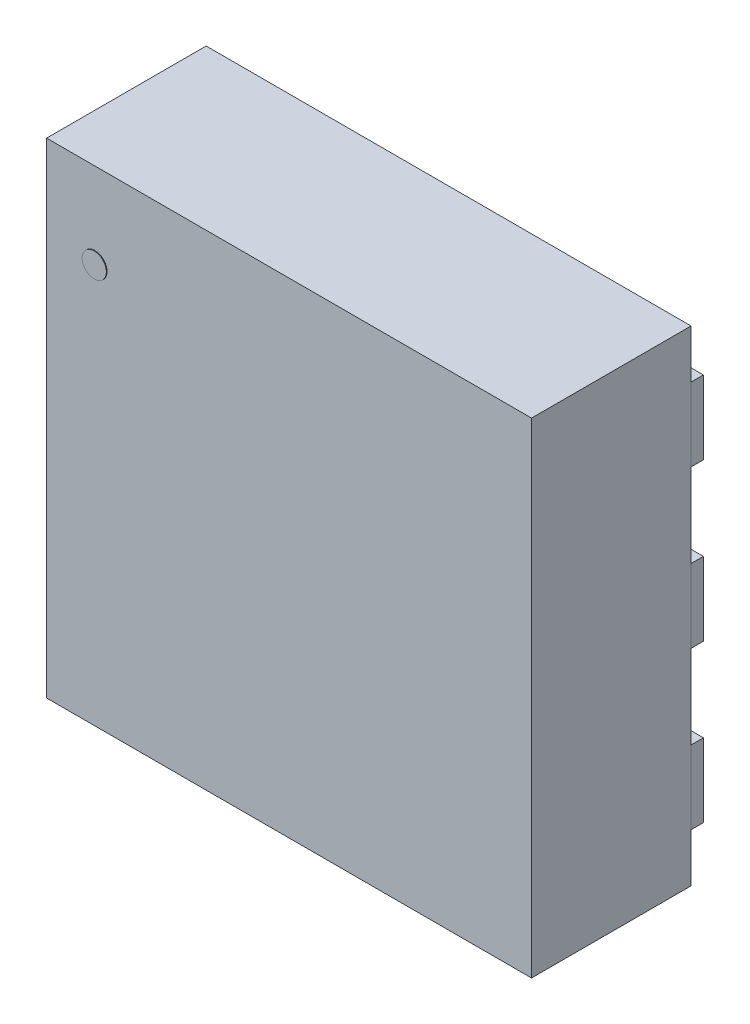
ISO-10303-21;
HEADER;
FILE_DESCRIPTION(('STEP AP214'),'2;1');
FILE_NAME('part.step','',(''),(''),'','','');
FILE_SCHEMA(('AUTOMOTIVE_DESIGN { 1 0 10303 214 1 1 1 1 }'));
ENDSEC;
DATA;
#1=APPLICATION_CONTEXT('core data for automotive mechanical design processes');
#2=APPLICATION_PROTOCOL_DEFINITION('international standard','automotive_design',2000,#1);
#3=PRODUCT_CONTEXT('',#1,'mechanical');
#4=PRODUCT('Part','Part','',(#3));
#5=PRODUCT_RELATED_PRODUCT_CATEGORY('part','',(#4));
#6=PRODUCT_DEFINITION_FORMATION('','',#4);
#7=PRODUCT_DEFINITION_CONTEXT('part definition',#1,'design');
#8=PRODUCT_DEFINITION('design','',#6,#7);
#9=PRODUCT_DEFINITION_SHAPE('','',#8);
#10=(LENGTH_UNIT() NAMED_UNIT(*) SI_UNIT(.MILLI.,.METRE.));
#11=(NAMED_UNIT(*) PLANE_ANGLE_UNIT() SI_UNIT($,.RADIAN.));
#12=(NAMED_UNIT(*) SI_UNIT($,.STERADIAN.) SOLID_ANGLE_UNIT());
#13=UNCERTAINTY_MEASURE_WITH_UNIT(LENGTH_MEASURE(1.E-05),#10,'distance_accuracy_value','');
#14=(GEOMETRIC_REPRESENTATION_CONTEXT(3) GLOBAL_UNCERTAINTY_ASSIGNED_CONTEXT((#13)) GLOBAL_UNIT_ASSIGNED_CONTEXT((#10,
#11,#12)) REPRESENTATION_CONTEXT('',''));
#15=CARTESIAN_POINT('',(0.,0.,0.));
#16=DIRECTION('',(0.,0.,1.));
#17=DIRECTION('',(1.,0.,0.));
#18=AXIS2_PLACEMENT_3D('',#15,#16,#17);
#19=CARTESIAN_POINT('',(-0.803,0.65,0.714));
#20=DIRECTION('',(0.,0.,1.));
#21=DIRECTION('',(1.,0.,0.));
#22=AXIS2_PLACEMENT_3D('',#19,#20,#21);
#23=PLANE('',#22);
#24=CARTESIAN_POINT('',(-0.803,0.65,0.714));
#25=DIRECTION('',(0.,0.,1.));
#26=DIRECTION('',(1.,0.,0.));
#27=AXIS2_PLACEMENT_3D('',#24,#25,#26);
#28=CIRCLE('',#27,0.050165);
#29=CARTESIAN_POINT('',(-0.752835,0.65,0.714));
#30=VERTEX_POINT('',#29);
#31=EDGE_CURVE('P0_E18',#30,#30,#28,.T.);
#32=ORIENTED_EDGE('',*,*,#31,.T.);
#33=EDGE_LOOP('',(#32));
#34=FACE_BOUND('',#33,.T.);
#35=ADVANCED_FACE('P0_F15',(#34),#23,.T.);
#36=CARTESIAN_POINT('',(-0.803,0.65,0.711));
#37=DIRECTION('',(0.,0.,1.));
#38=DIRECTION('',(1.,0.,0.));
#39=AXIS2_PLACEMENT_3D('',#36,#37,#38);
#40=PLANE('',#39);
#41=CARTESIAN_POINT('',(-0.803,0.65,0.711));
#42=DIRECTION('',(0.,0.,-1.));
#43=DIRECTION('',(1.,0.,0.));
#44=AXIS2_PLACEMENT_3D('',#41,#42,#43);
#45=CIRCLE('',#44,0.050165);
#46=CARTESIAN_POINT('',(-0.752835,0.65,0.711));
#47=VERTEX_POINT('',#46);
#48=EDGE_CURVE('P0_E10',#47,#47,#45,.T.);
#49=ORIENTED_EDGE('',*,*,#48,.T.);
#50=EDGE_LOOP('',(#49));
#51=FACE_BOUND('',#50,.T.);
#52=ADVANCED_FACE('P0_F37',(#51),#40,.F.);
#53=CARTESIAN_POINT('',(-0.803,0.65,0.711));
#54=DIRECTION('',(0.,0.,1.));
#55=DIRECTION('',(1.,0.,0.));
#56=AXIS2_PLACEMENT_3D('',#53,#54,#55);
#57=CYLINDRICAL_SURFACE('',#56,0.050165);
#58=ORIENTED_EDGE('',*,*,#31,.F.);
#59=EDGE_LOOP('',(#58));
#60=FACE_BOUND('',#59,.T.);
#61=ORIENTED_EDGE('',*,*,#48,.F.);
#62=EDGE_LOOP('',(#61));
#63=FACE_BOUND('',#62,.T.);
#64=ADVANCED_FACE('P0_F34',(#60,#63),#57,.T.);
#65=CLOSED_SHELL('',(#35,#52,#64));
#66=MANIFOLD_SOLID_BREP('P0_B1',#65);
#67=CARTESIAN_POINT('',(-1.003,-1.003,0.711));
#68=DIRECTION('',(0.,0.,1.));
#69=DIRECTION('',(1.,0.,0.));
#70=AXIS2_PLACEMENT_3D('',#67,#68,#69);
#71=PLANE('',#70);
#72=DIRECTION('',(1.,0.,0.));
#73=VECTOR('',#72,1.);
#74=CARTESIAN_POINT('',(-1.003,-1.003,0.711));
#75=LINE('',#74,#73);
#76=CARTESIAN_POINT('',(-1.003,-1.003,0.711));
#77=VERTEX_POINT('',#76);
#78=CARTESIAN_POINT('',(1.003,-1.003,0.711));
#79=VERTEX_POINT('',#78);
#80=EDGE_CURVE('P1_E71',#77,#79,#75,.T.);
#81=ORIENTED_EDGE('',*,*,#80,.T.);
#82=DIRECTION('',(0.,1.,0.));
#83=VECTOR('',#82,1.);
#84=CARTESIAN_POINT('',(1.003,-1.003,0.711));
#85=LINE('',#84,#83);
#86=CARTESIAN_POINT('',(1.003,1.003,0.711));
#87=VERTEX_POINT('',#86);
#88=EDGE_CURVE('P1_E104',#79,#87,#85,.T.);
#89=ORIENTED_EDGE('',*,*,#88,.T.);
#90=DIRECTION('',(-1.,0.,0.));
#91=VECTOR('',#90,1.);
#92=CARTESIAN_POINT('',(1.003,1.003,0.711));
#93=LINE('',#92,#91);
#94=CARTESIAN_POINT('',(-1.003,1.003,0.711));
#95=VERTEX_POINT('',#94);
#96=EDGE_CURVE('P1_E73',#87,#95,#93,.T.);
#97=ORIENTED_EDGE('',*,*,#96,.T.);
#98=DIRECTION('',(0.,-1.,0.));
#99=VECTOR('',#98,1.);
#100=CARTESIAN_POINT('',(-1.003,1.003,0.711));
#101=LINE('',#100,#99);
#102=EDGE_CURVE('P1_E11',#95,#77,#101,.T.);
#103=ORIENTED_EDGE('',*,*,#102,.T.);
#104=EDGE_LOOP('',(#81,#89,#97,#103));
#105=FACE_BOUND('',#104,.T.);
#106=ADVANCED_FACE('P1_F17',(#105),#71,.T.);
#107=CARTESIAN_POINT('',(-1.003,1.003,0.051));
#108=DIRECTION('',(0.,0.,-1.));
#109=DIRECTION('',(0.,-1.,0.));
#110=AXIS2_PLACEMENT_3D('',#107,#108,#109);
#111=PLANE('',#110);
#112=DIRECTION('',(1.,0.,0.));
#113=VECTOR('',#112,1.);
#114=CARTESIAN_POINT('',(-1.003,1.003,0.051));
#115=LINE('',#114,#113);
#116=CARTESIAN_POINT('',(-1.003,1.003,0.051));
#117=VERTEX_POINT('',#116);
#118=CARTESIAN_POINT('',(1.003,1.003,0.051));
#119=VERTEX_POINT('',#118);
#120=EDGE_CURVE('P1_E102',#117,#119,#115,.T.);
#121=ORIENTED_EDGE('',*,*,#120,.T.);
#122=DIRECTION('',(0.,-1.,0.));
#123=VECTOR('',#122,1.);
#124=CARTESIAN_POINT('',(1.003,1.003,0.051));
#125=LINE('',#124,#123);
#126=CARTESIAN_POINT('',(1.003,-1.003,0.051));
#127=VERTEX_POINT('',#126);
#128=EDGE_CURVE('P1_E81',#119,#127,#125,.T.);
#129=ORIENTED_EDGE('',*,*,#128,.T.);
#130=DIRECTION('',(-1.,0.,0.));
#131=VECTOR('',#130,1.);
#132=CARTESIAN_POINT('',(1.003,-1.003,0.051));
#133=LINE('',#132,#131);
#134=CARTESIAN_POINT('',(-1.003,-1.003,0.051));
#135=VERTEX_POINT('',#134);
#136=EDGE_CURVE('P1_E92',#127,#135,#133,.T.);
#137=ORIENTED_EDGE('',*,*,#136,.T.);
#138=DIRECTION('',(0.,1.,0.));
#139=VECTOR('',#138,1.);
#140=CARTESIAN_POINT('',(-1.003,-1.003,0.051));
#141=LINE('',#140,#139);
#142=EDGE_CURVE('P1_E20',#135,#117,#141,.T.);
#143=ORIENTED_EDGE('',*,*,#142,.T.);
#144=EDGE_LOOP('',(#121,#129,#137,#143));
#145=FACE_BOUND('',#144,.T.);
#146=ADVANCED_FACE('P1_F147',(#145),#111,.T.);
#147=CARTESIAN_POINT('',(-1.003,1.003,0.051));
#148=DIRECTION('',(-1.,0.,0.));
#149=DIRECTION('',(0.,0.,1.));
#150=AXIS2_PLACEMENT_3D('',#147,#148,#149);
#151=PLANE('',#150);
#152=ORIENTED_EDGE('',*,*,#142,.F.);
#153=DIRECTION('',(0.,0.,1.));
#154=VECTOR('',#153,1.);
#155=CARTESIAN_POINT('',(-1.003,-1.003,0.051));
#156=LINE('',#155,#154);
#157=EDGE_CURVE('P1_E76',#135,#77,#156,.T.);
#158=ORIENTED_EDGE('',*,*,#157,.T.);
#159=ORIENTED_EDGE('',*,*,#102,.F.);
#160=DIRECTION('',(0.,0.,-1.));
#161=VECTOR('',#160,1.);
#162=CARTESIAN_POINT('',(-1.003,1.003,0.711));
#163=LINE('',#162,#161);
#164=EDGE_CURVE('P1_E99',#95,#117,#163,.T.);
#165=ORIENTED_EDGE('',*,*,#164,.T.);
#166=EDGE_LOOP('',(#152,#158,#159,#165));
#167=FACE_BOUND('',#166,.T.);
#168=ADVANCED_FACE('P1_F77',(#167),#151,.T.);
#169=CARTESIAN_POINT('',(1.003,1.003,0.051));
#170=DIRECTION('',(0.,1.,0.));
#171=DIRECTION('',(1.,0.,0.));
#172=AXIS2_PLACEMENT_3D('',#169,#170,#171);
#173=PLANE('',#172);
#174=ORIENTED_EDGE('',*,*,#120,.F.);
#175=ORIENTED_EDGE('',*,*,#164,.F.);
#176=ORIENTED_EDGE('',*,*,#96,.F.);
#177=DIRECTION('',(0.,0.,-1.));
#178=VECTOR('',#177,1.);
#179=CARTESIAN_POINT('',(1.003,1.003,0.711));
#180=LINE('',#179,#178);
#181=EDGE_CURVE('P1_E96',#87,#119,#180,.T.);
#182=ORIENTED_EDGE('',*,*,#181,.T.);
#183=EDGE_LOOP('',(#174,#175,#176,#182));
#184=FACE_BOUND('',#183,.T.);
#185=ADVANCED_FACE('P1_F112',(#184),#173,.T.);
#186=CARTESIAN_POINT('',(1.003,-1.003,0.051));
#187=DIRECTION('',(1.,0.,0.));
#188=DIRECTION('',(0.,1.,0.));
#189=AXIS2_PLACEMENT_3D('',#186,#187,#188);
#190=PLANE('',#189);
#191=ORIENTED_EDGE('',*,*,#128,.F.);
#192=ORIENTED_EDGE('',*,*,#181,.F.);
#193=ORIENTED_EDGE('',*,*,#88,.F.);
#194=DIRECTION('',(0.,0.,-1.));
#195=VECTOR('',#194,1.);
#196=CARTESIAN_POINT('',(1.003,-1.003,0.711));
#197=LINE('',#196,#195);
#198=EDGE_CURVE('P1_E85',#79,#127,#197,.T.);
#199=ORIENTED_EDGE('',*,*,#198,.T.);
#200=EDGE_LOOP('',(#191,#192,#193,#199));
#201=FACE_BOUND('',#200,.T.);
#202=ADVANCED_FACE('P1_F118',(#201),#190,.T.);
#203=CARTESIAN_POINT('',(-1.003,-1.003,0.051));
#204=DIRECTION('',(0.,-1.,0.));
#205=DIRECTION('',(0.,0.,-1.));
#206=AXIS2_PLACEMENT_3D('',#203,#204,#205);
#207=PLANE('',#206);
#208=ORIENTED_EDGE('',*,*,#136,.F.);
#209=ORIENTED_EDGE('',*,*,#198,.F.);
#210=ORIENTED_EDGE('',*,*,#80,.F.);
#211=ORIENTED_EDGE('',*,*,#157,.F.);
#212=EDGE_LOOP('',(#208,#209,#210,#211));
#213=FACE_BOUND('',#212,.T.);
#214=ADVANCED_FACE('P1_F83',(#213),#207,.T.);
#215=CLOSED_SHELL('',(#106,#146,#168,#185,#202,#214));
#216=MANIFOLD_SOLID_BREP('P1_B1',#215);
#217=CARTESIAN_POINT('',(1.003,0.498,0.));
#218=DIRECTION('',(0.,0.,-1.));
#219=DIRECTION('',(0.,-1.,0.));
#220=AXIS2_PLACEMENT_3D('',#217,#218,#219);
#221=PLANE('',#220);
#222=DIRECTION('',(-1.,0.,0.));
#223=VECTOR('',#222,1.);
#224=CARTESIAN_POINT('',(1.003,0.498,0.));
#225=LINE('',#224,#223);
#226=CARTESIAN_POINT('',(1.003,0.498,0.));
#227=VERTEX_POINT('',#226);
#228=CARTESIAN_POINT('',(0.572,0.498,0.));
#229=VERTEX_POINT('',#228);
#230=EDGE_CURVE('P2_E73',#227,#229,#225,.T.);
#231=ORIENTED_EDGE('',*,*,#230,.T.);
#232=DIRECTION('',(0.,1.,0.));
#233=VECTOR('',#232,1.);
#234=CARTESIAN_POINT('',(0.572,0.498,0.));
#235=LINE('',#234,#233);
#236=CARTESIAN_POINT('',(0.572,0.802,0.));
#237=VERTEX_POINT('',#236);
#238=EDGE_CURVE('P2_E11',#229,#237,#235,.T.);
#239=ORIENTED_EDGE('',*,*,#238,.T.);
#240=DIRECTION('',(1.,0.,0.));
#241=VECTOR('',#240,1.);
#242=CARTESIAN_POINT('',(0.572,0.802,0.));
#243=LINE('',#242,#241);
#244=CARTESIAN_POINT('',(1.003,0.802,0.));
#245=VERTEX_POINT('',#244);
#246=EDGE_CURVE('P2_E75',#237,#245,#243,.T.);
#247=ORIENTED_EDGE('',*,*,#246,.T.);
#248=DIRECTION('',(0.,-1.,0.));
#249=VECTOR('',#248,1.);
#250=CARTESIAN_POINT('',(1.003,0.802,0.));
#251=LINE('',#250,#249);
#252=EDGE_CURVE('P2_E26',#245,#227,#251,.T.);
#253=ORIENTED_EDGE('',*,*,#252,.T.);
#254=EDGE_LOOP('',(#231,#239,#247,#253));
#255=FACE_BOUND('',#254,.T.);
#256=ADVANCED_FACE('P2_F17',(#255),#221,.T.);
#257=CARTESIAN_POINT('',(0.572,0.802,0.));
#258=DIRECTION('',(-1.,0.,0.));
#259=DIRECTION('',(0.,0.,1.));
#260=AXIS2_PLACEMENT_3D('',#257,#258,#259);
#261=PLANE('',#260);
#262=ORIENTED_EDGE('',*,*,#238,.F.);
#263=DIRECTION('',(0.,0.,1.));
#264=VECTOR('',#263,1.);
#265=CARTESIAN_POINT('',(0.572,0.498,0.));
#266=LINE('',#265,#264);
#267=CARTESIAN_POINT('',(0.572,0.498,0.051));
#268=VERTEX_POINT('',#267);
#269=EDGE_CURVE('P2_E88',#229,#268,#266,.T.);
#270=ORIENTED_EDGE('',*,*,#269,.T.);
#271=DIRECTION('',(0.,1.,0.));
#272=VECTOR('',#271,1.);
#273=CARTESIAN_POINT('',(0.572,0.498,0.051));
#274=LINE('',#273,#272);
#275=CARTESIAN_POINT('',(0.572,0.802,0.051));
#276=VERTEX_POINT('',#275);
#277=EDGE_CURVE('P2_E38',#268,#276,#274,.T.);
#278=ORIENTED_EDGE('',*,*,#277,.T.);
#279=DIRECTION('',(0.,0.,-1.));
#280=VECTOR('',#279,1.);
#281=CARTESIAN_POINT('',(0.572,0.802,0.051));
#282=LINE('',#281,#280);
#283=EDGE_CURVE('P2_E101',#276,#237,#282,.T.);
#284=ORIENTED_EDGE('',*,*,#283,.T.);
#285=EDGE_LOOP('',(#262,#270,#278,#284));
#286=FACE_BOUND('',#285,.T.);
#287=ADVANCED_FACE('P2_F19',(#286),#261,.T.);
#288=CARTESIAN_POINT('',(1.003,0.498,0.));
#289=DIRECTION('',(1.,0.,0.));
#290=DIRECTION('',(0.,1.,0.));
#291=AXIS2_PLACEMENT_3D('',#288,#289,#290);
#292=PLANE('',#291);
#293=DIRECTION('',(0.,-1.,0.));
#294=VECTOR('',#293,1.);
#295=CARTESIAN_POINT('',(1.003,0.802,0.051));
#296=LINE('',#295,#294);
#297=CARTESIAN_POINT('',(1.003,0.802,0.051));
#298=VERTEX_POINT('',#297);
#299=CARTESIAN_POINT('',(1.003,0.498,0.051));
#300=VERTEX_POINT('',#299);
#301=EDGE_CURVE('P2_E51',#298,#300,#296,.T.);
#302=ORIENTED_EDGE('',*,*,#301,.T.);
#303=DIRECTION('',(0.,0.,-1.));
#304=VECTOR('',#303,1.);
#305=CARTESIAN_POINT('',(1.003,0.498,0.356));
#306=LINE('',#305,#304);
#307=EDGE_CURVE('P2_E79',#300,#227,#306,.T.);
#308=ORIENTED_EDGE('',*,*,#307,.T.);
#309=ORIENTED_EDGE('',*,*,#252,.F.);
#310=DIRECTION('',(0.,0.,1.));
#311=VECTOR('',#310,1.);
#312=CARTESIAN_POINT('',(1.003,0.802,0.));
#313=LINE('',#312,#311);
#314=EDGE_CURVE('P2_E90',#245,#298,#313,.T.);
#315=ORIENTED_EDGE('',*,*,#314,.T.);
#316=EDGE_LOOP('',(#302,#308,#309,#315));
#317=FACE_BOUND('',#316,.T.);
#318=ADVANCED_FACE('P2_F80',(#317),#292,.T.);
#319=CARTESIAN_POINT('',(1.003,0.802,0.051));
#320=DIRECTION('',(0.,0.,1.));
#321=DIRECTION('',(1.,0.,0.));
#322=AXIS2_PLACEMENT_3D('',#319,#320,#321);
#323=PLANE('',#322);
#324=DIRECTION('',(-1.,0.,0.));
#325=VECTOR('',#324,1.);
#326=CARTESIAN_POINT('',(1.003,0.802,0.051));
#327=LINE('',#326,#325);
#328=EDGE_CURVE('P2_E96',#298,#276,#327,.T.);
#329=ORIENTED_EDGE('',*,*,#328,.T.);
#330=ORIENTED_EDGE('',*,*,#277,.F.);
#331=DIRECTION('',(1.,0.,0.));
#332=VECTOR('',#331,1.);
#333=CARTESIAN_POINT('',(0.572,0.498,0.051));
#334=LINE('',#333,#332);
#335=EDGE_CURVE('P2_E84',#268,#300,#334,.T.);
#336=ORIENTED_EDGE('',*,*,#335,.T.);
#337=ORIENTED_EDGE('',*,*,#301,.F.);
#338=EDGE_LOOP('',(#329,#330,#336,#337));
#339=FACE_BOUND('',#338,.T.);
#340=ADVANCED_FACE('P2_F137',(#339),#323,.T.);
#341=CARTESIAN_POINT('',(0.572,0.498,0.));
#342=DIRECTION('',(0.,-1.,0.));
#343=DIRECTION('',(0.,0.,-1.));
#344=AXIS2_PLACEMENT_3D('',#341,#342,#343);
#345=PLANE('',#344);
#346=ORIENTED_EDGE('',*,*,#230,.F.);
#347=ORIENTED_EDGE('',*,*,#307,.F.);
#348=ORIENTED_EDGE('',*,*,#335,.F.);
#349=ORIENTED_EDGE('',*,*,#269,.F.);
#350=EDGE_LOOP('',(#346,#347,#348,#349));
#351=FACE_BOUND('',#350,.T.);
#352=ADVANCED_FACE('P2_F87',(#351),#345,.T.);
#353=CARTESIAN_POINT('',(1.003,0.802,0.));
#354=DIRECTION('',(0.,1.,0.));
#355=DIRECTION('',(1.,0.,0.));
#356=AXIS2_PLACEMENT_3D('',#353,#354,#355);
#357=PLANE('',#356);
#358=ORIENTED_EDGE('',*,*,#246,.F.);
#359=ORIENTED_EDGE('',*,*,#283,.F.);
#360=ORIENTED_EDGE('',*,*,#328,.F.);
#361=ORIENTED_EDGE('',*,*,#314,.F.);
#362=EDGE_LOOP('',(#358,#359,#360,#361));
#363=FACE_BOUND('',#362,.T.);
#364=ADVANCED_FACE('P2_F119',(#363),#357,.T.);
#365=CLOSED_SHELL('',(#256,#287,#318,#340,#352,#364));
#366=MANIFOLD_SOLID_BREP('P2_B1',#365);
#367=CARTESIAN_POINT('',(1.003,-0.152,0.));
#368=DIRECTION('',(0.,0.,-1.));
#369=DIRECTION('',(0.,-1.,0.));
#370=AXIS2_PLACEMENT_3D('',#367,#368,#369);
#371=PLANE('',#370);
#372=DIRECTION('',(-1.,0.,0.));
#373=VECTOR('',#372,1.);
#374=CARTESIAN_POINT('',(1.003,-0.152,0.));
#375=LINE('',#374,#373);
#376=CARTESIAN_POINT('',(1.003,-0.152,0.));
#377=VERTEX_POINT('',#376);
#378=CARTESIAN_POINT('',(0.572,-0.152,0.));
#379=VERTEX_POINT('',#378);
#380=EDGE_CURVE('P3_E67',#377,#379,#375,.T.);
#381=ORIENTED_EDGE('',*,*,#380,.T.);
#382=DIRECTION('',(0.,1.,0.));
#383=VECTOR('',#382,1.);
#384=CARTESIAN_POINT('',(0.572,-0.152,0.));
#385=LINE('',#384,#383);
#386=CARTESIAN_POINT('',(0.572,0.152,0.));
#387=VERTEX_POINT('',#386);
#388=EDGE_CURVE('P3_E11',#379,#387,#385,.T.);
#389=ORIENTED_EDGE('',*,*,#388,.T.);
#390=DIRECTION('',(1.,0.,0.));
#391=VECTOR('',#390,1.);
#392=CARTESIAN_POINT('',(0.572,0.152,0.));
#393=LINE('',#392,#391);
#394=CARTESIAN_POINT('',(1.003,0.152,0.));
#395=VERTEX_POINT('',#394);
#396=EDGE_CURVE('P3_E69',#387,#395,#393,.T.);
#397=ORIENTED_EDGE('',*,*,#396,.T.);
#398=DIRECTION('',(0.,-1.,0.));
#399=VECTOR('',#398,1.);
#400=CARTESIAN_POINT('',(1.003,0.152,0.));
#401=LINE('',#400,#399);
#402=EDGE_CURVE('P3_E26',#395,#377,#401,.T.);
#403=ORIENTED_EDGE('',*,*,#402,.T.);
#404=EDGE_LOOP('',(#381,#389,#397,#403));
#405=FACE_BOUND('',#404,.T.);
#406=ADVANCED_FACE('P3_F17',(#405),#371,.T.);
#407=CARTESIAN_POINT('',(0.572,0.152,0.));
#408=DIRECTION('',(-1.,0.,0.));
#409=DIRECTION('',(0.,0.,1.));
#410=AXIS2_PLACEMENT_3D('',#407,#408,#409);
#411=PLANE('',#410);
#412=ORIENTED_EDGE('',*,*,#388,.F.);
#413=DIRECTION('',(0.,0.,1.));
#414=VECTOR('',#413,1.);
#415=CARTESIAN_POINT('',(0.572,-0.152,0.));
#416=LINE('',#415,#414);
#417=CARTESIAN_POINT('',(0.572,-0.152,0.051));
#418=VERTEX_POINT('',#417);
#419=EDGE_CURVE('P3_E86',#379,#418,#416,.T.);
#420=ORIENTED_EDGE('',*,*,#419,.T.);
#421=DIRECTION('',(0.,1.,0.));
#422=VECTOR('',#421,1.);
#423=CARTESIAN_POINT('',(0.572,-0.152,0.051));
#424=LINE('',#423,#422);
#425=CARTESIAN_POINT('',(0.572,0.152,0.051));
#426=VERTEX_POINT('',#425);
#427=EDGE_CURVE('P3_E38',#418,#426,#424,.T.);
#428=ORIENTED_EDGE('',*,*,#427,.T.);
#429=DIRECTION('',(0.,0.,-1.));
#430=VECTOR('',#429,1.);
#431=CARTESIAN_POINT('',(0.572,0.152,0.051));
#432=LINE('',#431,#430);
#433=EDGE_CURVE('P3_E164',#426,#387,#432,.T.);
#434=ORIENTED_EDGE('',*,*,#433,.T.);
#435=EDGE_LOOP('',(#412,#420,#428,#434));
#436=FACE_BOUND('',#435,.T.);
#437=ADVANCED_FACE('P3_F140',(#436),#411,.T.);
#438=CARTESIAN_POINT('',(1.003,-0.152,0.));
#439=DIRECTION('',(1.,0.,0.));
#440=DIRECTION('',(0.,1.,0.));
#441=AXIS2_PLACEMENT_3D('',#438,#439,#440);
#442=PLANE('',#441);
#443=DIRECTION('',(0.,-1.,0.));
#444=VECTOR('',#443,1.);
#445=CARTESIAN_POINT('',(1.003,0.152,0.051));
#446=LINE('',#445,#444);
#447=CARTESIAN_POINT('',(1.003,0.152,0.051));
#448=VERTEX_POINT('',#447);
#449=CARTESIAN_POINT('',(1.003,-0.152,0.051));
#450=VERTEX_POINT('',#449);
#451=EDGE_CURVE('P3_E74',#448,#450,#446,.T.);
#452=ORIENTED_EDGE('',*,*,#451,.T.);
#453=DIRECTION('',(0.,0.,-1.));
#454=VECTOR('',#453,1.);
#455=CARTESIAN_POINT('',(1.003,-0.152,0.356));
#456=LINE('',#455,#454);
#457=EDGE_CURVE('P3_E77',#450,#377,#456,.T.);
#458=ORIENTED_EDGE('',*,*,#457,.T.);
#459=ORIENTED_EDGE('',*,*,#402,.F.);
#460=DIRECTION('',(0.,0.,1.));
#461=VECTOR('',#460,1.);
#462=CARTESIAN_POINT('',(1.003,0.152,0.));
#463=LINE('',#462,#461);
#464=EDGE_CURVE('P3_E88',#395,#448,#463,.T.);
#465=ORIENTED_EDGE('',*,*,#464,.T.);
#466=EDGE_LOOP('',(#452,#458,#459,#465));
#467=FACE_BOUND('',#466,.T.);
#468=ADVANCED_FACE('P3_F78',(#467),#442,.T.);
#469=CARTESIAN_POINT('',(1.003,0.152,0.051));
#470=DIRECTION('',(0.,0.,1.));
#471=DIRECTION('',(1.,0.,0.));
#472=AXIS2_PLACEMENT_3D('',#469,#470,#471);
#473=PLANE('',#472);
#474=DIRECTION('',(-1.,0.,0.));
#475=VECTOR('',#474,1.);
#476=CARTESIAN_POINT('',(1.003,0.152,0.051));
#477=LINE('',#476,#475);
#478=EDGE_CURVE('P3_E93',#448,#426,#477,.T.);
#479=ORIENTED_EDGE('',*,*,#478,.T.);
#480=ORIENTED_EDGE('',*,*,#427,.F.);
#481=DIRECTION('',(1.,0.,0.));
#482=VECTOR('',#481,1.);
#483=CARTESIAN_POINT('',(0.572,-0.152,0.051));
#484=LINE('',#483,#482);
#485=EDGE_CURVE('P3_E82',#418,#450,#484,.T.);
#486=ORIENTED_EDGE('',*,*,#485,.T.);
#487=ORIENTED_EDGE('',*,*,#451,.F.);
#488=EDGE_LOOP('',(#479,#480,#486,#487));
#489=FACE_BOUND('',#488,.T.);
#490=ADVANCED_FACE('P3_F121',(#489),#473,.T.);
#491=CARTESIAN_POINT('',(0.572,-0.152,0.));
#492=DIRECTION('',(0.,-1.,0.));
#493=DIRECTION('',(0.,0.,-1.));
#494=AXIS2_PLACEMENT_3D('',#491,#492,#493);
#495=PLANE('',#494);
#496=ORIENTED_EDGE('',*,*,#380,.F.);
#497=ORIENTED_EDGE('',*,*,#457,.F.);
#498=ORIENTED_EDGE('',*,*,#485,.F.);
#499=ORIENTED_EDGE('',*,*,#419,.F.);
#500=EDGE_LOOP('',(#496,#497,#498,#499));
#501=FACE_BOUND('',#500,.T.);
#502=ADVANCED_FACE('P3_F85',(#501),#495,.T.);
#503=CARTESIAN_POINT('',(1.003,0.152,0.));
#504=DIRECTION('',(0.,1.,0.));
#505=DIRECTION('',(1.,0.,0.));
#506=AXIS2_PLACEMENT_3D('',#503,#504,#505);
#507=PLANE('',#506);
#508=ORIENTED_EDGE('',*,*,#396,.F.);
#509=ORIENTED_EDGE('',*,*,#433,.F.);
#510=ORIENTED_EDGE('',*,*,#478,.F.);
#511=ORIENTED_EDGE('',*,*,#464,.F.);
#512=EDGE_LOOP('',(#508,#509,#510,#511));
#513=FACE_BOUND('',#512,.T.);
#514=ADVANCED_FACE('P3_F103',(#513),#507,.T.);
#515=CLOSED_SHELL('',(#406,#437,#468,#490,#502,#514));
#516=MANIFOLD_SOLID_BREP('P3_B1',#515);
#517=CARTESIAN_POINT('',(1.003,-0.802,0.));
#518=DIRECTION('',(0.,0.,-1.));
#519=DIRECTION('',(0.,-1.,0.));
#520=AXIS2_PLACEMENT_3D('',#517,#518,#519);
#521=PLANE('',#520);
#522=DIRECTION('',(-1.,0.,0.));
#523=VECTOR('',#522,1.);
#524=CARTESIAN_POINT('',(1.003,-0.802,0.));
#525=LINE('',#524,#523);
#526=CARTESIAN_POINT('',(1.003,-0.802,0.));
#527=VERTEX_POINT('',#526);
#528=CARTESIAN_POINT('',(0.572,-0.802,0.));
#529=VERTEX_POINT('',#528);
#530=EDGE_CURVE('P4_E76',#527,#529,#525,.T.);
#531=ORIENTED_EDGE('',*,*,#530,.T.);
#532=DIRECTION('',(0.,1.,0.));
#533=VECTOR('',#532,1.);
#534=CARTESIAN_POINT('',(0.572,-0.802,0.));
#535=LINE('',#534,#533);
#536=CARTESIAN_POINT('',(0.572,-0.498,0.));
#537=VERTEX_POINT('',#536);
#538=EDGE_CURVE('P4_E11',#529,#537,#535,.T.);
#539=ORIENTED_EDGE('',*,*,#538,.T.);
#540=DIRECTION('',(1.,0.,0.));
#541=VECTOR('',#540,1.);
#542=CARTESIAN_POINT('',(0.572,-0.498,0.));
#543=LINE('',#542,#541);
#544=CARTESIAN_POINT('',(1.003,-0.498,0.));
#545=VERTEX_POINT('',#544);
#546=EDGE_CURVE('P4_E74',#537,#545,#543,.T.);
#547=ORIENTED_EDGE('',*,*,#546,.T.);
#548=DIRECTION('',(0.,-1.,0.));
#549=VECTOR('',#548,1.);
#550=CARTESIAN_POINT('',(1.003,-0.498,0.));
#551=LINE('',#550,#549);
#552=EDGE_CURVE('P4_E25',#545,#527,#551,.T.);
#553=ORIENTED_EDGE('',*,*,#552,.T.);
#554=EDGE_LOOP('',(#531,#539,#547,#553));
#555=FACE_BOUND('',#554,.T.);
#556=ADVANCED_FACE('P4_F17',(#555),#521,.T.);
#557=CARTESIAN_POINT('',(0.572,-0.498,0.));
#558=DIRECTION('',(-1.,0.,0.));
#559=DIRECTION('',(0.,0.,1.));
#560=AXIS2_PLACEMENT_3D('',#557,#558,#559);
#561=PLANE('',#560);
#562=ORIENTED_EDGE('',*,*,#538,.F.);
#563=DIRECTION('',(0.,0.,1.));
#564=VECTOR('',#563,1.);
#565=CARTESIAN_POINT('',(0.572,-0.802,0.));
#566=LINE('',#565,#564);
#567=CARTESIAN_POINT('',(0.572,-0.802,0.051));
#568=VERTEX_POINT('',#567);
#569=EDGE_CURVE('P4_E95',#529,#568,#566,.T.);
#570=ORIENTED_EDGE('',*,*,#569,.T.);
#571=DIRECTION('',(0.,1.,0.));
#572=VECTOR('',#571,1.);
#573=CARTESIAN_POINT('',(0.572,-0.802,0.051));
#574=LINE('',#573,#572);
#575=CARTESIAN_POINT('',(0.572,-0.498,0.051));
#576=VERTEX_POINT('',#575);
#577=EDGE_CURVE('P4_E37',#568,#576,#574,.T.);
#578=ORIENTED_EDGE('',*,*,#577,.T.);
#579=DIRECTION('',(0.,0.,-1.));
#580=VECTOR('',#579,1.);
#581=CARTESIAN_POINT('',(0.572,-0.498,0.051));
#582=LINE('',#581,#580);
#583=EDGE_CURVE('P4_E80',#576,#537,#582,.T.);
#584=ORIENTED_EDGE('',*,*,#583,.T.);
#585=EDGE_LOOP('',(#562,#570,#578,#584));
#586=FACE_BOUND('',#585,.T.);
#587=ADVANCED_FACE('P4_F81',(#586),#561,.T.);
#588=CARTESIAN_POINT('',(1.003,-0.802,0.));
#589=DIRECTION('',(1.,0.,0.));
#590=DIRECTION('',(0.,1.,0.));
#591=AXIS2_PLACEMENT_3D('',#588,#589,#590);
#592=PLANE('',#591);
#593=DIRECTION('',(0.,-1.,0.));
#594=VECTOR('',#593,1.);
#595=CARTESIAN_POINT('',(1.003,-0.498,0.051));
#596=LINE('',#595,#594);
#597=CARTESIAN_POINT('',(1.003,-0.498,0.051));
#598=VERTEX_POINT('',#597);
#599=CARTESIAN_POINT('',(1.003,-0.802,0.051));
#600=VERTEX_POINT('',#599);
#601=EDGE_CURVE('P4_E47',#598,#600,#596,.T.);
#602=ORIENTED_EDGE('',*,*,#601,.T.);
#603=DIRECTION('',(0.,0.,-1.));
#604=VECTOR('',#603,1.);
#605=CARTESIAN_POINT('',(1.003,-0.802,0.356));
#606=LINE('',#605,#604);
#607=EDGE_CURVE('P4_E103',#600,#527,#606,.T.);
#608=ORIENTED_EDGE('',*,*,#607,.T.);
#609=ORIENTED_EDGE('',*,*,#552,.F.);
#610=DIRECTION('',(0.,0.,1.));
#611=VECTOR('',#610,1.);
#612=CARTESIAN_POINT('',(1.003,-0.498,0.));
#613=LINE('',#612,#611);
#614=EDGE_CURVE('P4_E89',#545,#598,#613,.T.);
#615=ORIENTED_EDGE('',*,*,#614,.T.);
#616=EDGE_LOOP('',(#602,#608,#609,#615));
#617=FACE_BOUND('',#616,.T.);
#618=ADVANCED_FACE('P4_F115',(#617),#592,.T.);
#619=CARTESIAN_POINT('',(1.003,-0.498,0.051));
#620=DIRECTION('',(0.,0.,1.));
#621=DIRECTION('',(1.,0.,0.));
#622=AXIS2_PLACEMENT_3D('',#619,#620,#621);
#623=PLANE('',#622);
#624=DIRECTION('',(-1.,0.,0.));
#625=VECTOR('',#624,1.);
#626=CARTESIAN_POINT('',(1.003,-0.498,0.051));
#627=LINE('',#626,#625);
#628=EDGE_CURVE('P4_E85',#598,#576,#627,.T.);
#629=ORIENTED_EDGE('',*,*,#628,.T.);
#630=ORIENTED_EDGE('',*,*,#577,.F.);
#631=DIRECTION('',(1.,0.,0.));
#632=VECTOR('',#631,1.);
#633=CARTESIAN_POINT('',(0.572,-0.802,0.051));
#634=LINE('',#633,#632);
#635=EDGE_CURVE('P4_E104',#568,#600,#634,.T.);
#636=ORIENTED_EDGE('',*,*,#635,.T.);
#637=ORIENTED_EDGE('',*,*,#601,.F.);
#638=EDGE_LOOP('',(#629,#630,#636,#637));
#639=FACE_BOUND('',#638,.T.);
#640=ADVANCED_FACE('P4_F122',(#639),#623,.T.);
#641=CARTESIAN_POINT('',(0.572,-0.802,0.));
#642=DIRECTION('',(0.,-1.,0.));
#643=DIRECTION('',(0.,0.,-1.));
#644=AXIS2_PLACEMENT_3D('',#641,#642,#643);
#645=PLANE('',#644);
#646=ORIENTED_EDGE('',*,*,#530,.F.);
#647=ORIENTED_EDGE('',*,*,#607,.F.);
#648=ORIENTED_EDGE('',*,*,#635,.F.);
#649=ORIENTED_EDGE('',*,*,#569,.F.);
#650=EDGE_LOOP('',(#646,#647,#648,#649));
#651=FACE_BOUND('',#650,.T.);
#652=ADVANCED_FACE('P4_F118',(#651),#645,.T.);
#653=CARTESIAN_POINT('',(1.003,-0.498,0.));
#654=DIRECTION('',(0.,1.,0.));
#655=DIRECTION('',(1.,0.,0.));
#656=AXIS2_PLACEMENT_3D('',#653,#654,#655);
#657=PLANE('',#656);
#658=ORIENTED_EDGE('',*,*,#546,.F.);
#659=ORIENTED_EDGE('',*,*,#583,.F.);
#660=ORIENTED_EDGE('',*,*,#628,.F.);
#661=ORIENTED_EDGE('',*,*,#614,.F.);
#662=EDGE_LOOP('',(#658,#659,#660,#661));
#663=FACE_BOUND('',#662,.T.);
#664=ADVANCED_FACE('P4_F88',(#663),#657,.T.);
#665=CLOSED_SHELL('',(#556,#587,#618,#640,#652,#664));
#666=MANIFOLD_SOLID_BREP('P4_B1',#665);
#667=CARTESIAN_POINT('',(-1.003,-0.498,0.));
#668=DIRECTION('',(0.,0.,-1.));
#669=DIRECTION('',(0.,-1.,0.));
#670=AXIS2_PLACEMENT_3D('',#667,#668,#669);
#671=PLANE('',#670);
#672=DIRECTION('',(1.,0.,0.));
#673=VECTOR('',#672,1.);
#674=CARTESIAN_POINT('',(-1.003,-0.498,0.));
#675=LINE('',#674,#673);
#676=CARTESIAN_POINT('',(-1.003,-0.498,0.));
#677=VERTEX_POINT('',#676);
#678=CARTESIAN_POINT('',(-0.572,-0.498,0.));
#679=VERTEX_POINT('',#678);
#680=EDGE_CURVE('P5_E77',#677,#679,#675,.T.);
#681=ORIENTED_EDGE('',*,*,#680,.T.);
#682=DIRECTION('',(0.,-1.,0.));
#683=VECTOR('',#682,1.);
#684=CARTESIAN_POINT('',(-0.572,-0.498,0.));
#685=LINE('',#684,#683);
#686=CARTESIAN_POINT('',(-0.572,-0.802,0.));
#687=VERTEX_POINT('',#686);
#688=EDGE_CURVE('P5_E11',#679,#687,#685,.T.);
#689=ORIENTED_EDGE('',*,*,#688,.T.);
#690=DIRECTION('',(-1.,0.,0.));
#691=VECTOR('',#690,1.);
#692=CARTESIAN_POINT('',(-0.572,-0.802,0.));
#693=LINE('',#692,#691);
#694=CARTESIAN_POINT('',(-1.003,-0.802,0.));
#695=VERTEX_POINT('',#694);
#696=EDGE_CURVE('P5_E75',#687,#695,#693,.T.);
#697=ORIENTED_EDGE('',*,*,#696,.T.);
#698=DIRECTION('',(0.,1.,0.));
#699=VECTOR('',#698,1.);
#700=CARTESIAN_POINT('',(-1.003,-0.802,0.));
#701=LINE('',#700,#699);
#702=EDGE_CURVE('P5_E26',#695,#677,#701,.T.);
#703=ORIENTED_EDGE('',*,*,#702,.T.);
#704=EDGE_LOOP('',(#681,#689,#697,#703));
#705=FACE_BOUND('',#704,.T.);
#706=ADVANCED_FACE('P5_F17',(#705),#671,.T.);
#707=CARTESIAN_POINT('',(-0.572,-0.802,0.));
#708=DIRECTION('',(1.,0.,0.));
#709=DIRECTION('',(0.,1.,0.));
#710=AXIS2_PLACEMENT_3D('',#707,#708,#709);
#711=PLANE('',#710);
#712=ORIENTED_EDGE('',*,*,#688,.F.);
#713=DIRECTION('',(0.,0.,1.));
#714=VECTOR('',#713,1.);
#715=CARTESIAN_POINT('',(-0.572,-0.498,0.));
#716=LINE('',#715,#714);
#717=CARTESIAN_POINT('',(-0.572,-0.498,0.051));
#718=VERTEX_POINT('',#717);
#719=EDGE_CURVE('P5_E109',#679,#718,#716,.T.);
#720=ORIENTED_EDGE('',*,*,#719,.T.);
#721=DIRECTION('',(0.,-1.,0.));
#722=VECTOR('',#721,1.);
#723=CARTESIAN_POINT('',(-0.572,-0.498,0.051));
#724=LINE('',#723,#722);
#725=CARTESIAN_POINT('',(-0.572,-0.802,0.051));
#726=VERTEX_POINT('',#725);
#727=EDGE_CURVE('P5_E20',#718,#726,#724,.T.);
#728=ORIENTED_EDGE('',*,*,#727,.T.);
#729=DIRECTION('',(0.,0.,-1.));
#730=VECTOR('',#729,1.);
#731=CARTESIAN_POINT('',(-0.572,-0.802,0.051));
#732=LINE('',#731,#730);
#733=EDGE_CURVE('P5_E81',#726,#687,#732,.T.);
#734=ORIENTED_EDGE('',*,*,#733,.T.);
#735=EDGE_LOOP('',(#712,#720,#728,#734));
#736=FACE_BOUND('',#735,.T.);
#737=ADVANCED_FACE('P5_F82',(#736),#711,.T.);
#738=CARTESIAN_POINT('',(-1.003,-0.498,0.));
#739=DIRECTION('',(-1.,0.,0.));
#740=DIRECTION('',(0.,0.,1.));
#741=AXIS2_PLACEMENT_3D('',#738,#739,#740);
#742=PLANE('',#741);
#743=DIRECTION('',(0.,1.,0.));
#744=VECTOR('',#743,1.);
#745=CARTESIAN_POINT('',(-1.003,-0.802,0.051));
#746=LINE('',#745,#744);
#747=CARTESIAN_POINT('',(-1.003,-0.802,0.051));
#748=VERTEX_POINT('',#747);
#749=CARTESIAN_POINT('',(-1.003,-0.498,0.051));
#750=VERTEX_POINT('',#749);
#751=EDGE_CURVE('P5_E48',#748,#750,#746,.T.);
#752=ORIENTED_EDGE('',*,*,#751,.T.);
#753=DIRECTION('',(0.,0.,-1.));
#754=VECTOR('',#753,1.);
#755=CARTESIAN_POINT('',(-1.003,-0.498,0.356));
#756=LINE('',#755,#754);
#757=EDGE_CURVE('P5_E101',#750,#677,#756,.T.);
#758=ORIENTED_EDGE('',*,*,#757,.T.);
#759=ORIENTED_EDGE('',*,*,#702,.F.);
#760=DIRECTION('',(0.,0.,1.));
#761=VECTOR('',#760,1.);
#762=CARTESIAN_POINT('',(-1.003,-0.802,0.));
#763=LINE('',#762,#761);
#764=EDGE_CURVE('P5_E90',#695,#748,#763,.T.);
#765=ORIENTED_EDGE('',*,*,#764,.T.);
#766=EDGE_LOOP('',(#752,#758,#759,#765));
#767=FACE_BOUND('',#766,.T.);
#768=ADVANCED_FACE('P5_F115',(#767),#742,.T.);
#769=CARTESIAN_POINT('',(-1.003,-0.802,0.051));
#770=DIRECTION('',(0.,0.,1.));
#771=DIRECTION('',(1.,0.,0.));
#772=AXIS2_PLACEMENT_3D('',#769,#770,#771);
#773=PLANE('',#772);
#774=DIRECTION('',(1.,0.,0.));
#775=VECTOR('',#774,1.);
#776=CARTESIAN_POINT('',(-1.003,-0.802,0.051));
#777=LINE('',#776,#775);
#778=EDGE_CURVE('P5_E86',#748,#726,#777,.T.);
#779=ORIENTED_EDGE('',*,*,#778,.T.);
#780=ORIENTED_EDGE('',*,*,#727,.F.);
#781=DIRECTION('',(-1.,0.,0.));
#782=VECTOR('',#781,1.);
#783=CARTESIAN_POINT('',(-0.572,-0.498,0.051));
#784=LINE('',#783,#782);
#785=EDGE_CURVE('P5_E106',#718,#750,#784,.T.);
#786=ORIENTED_EDGE('',*,*,#785,.T.);
#787=ORIENTED_EDGE('',*,*,#751,.F.);
#788=EDGE_LOOP('',(#779,#780,#786,#787));
#789=FACE_BOUND('',#788,.T.);
#790=ADVANCED_FACE('P5_F119',(#789),#773,.T.);
#791=CARTESIAN_POINT('',(-0.572,-0.498,0.));
#792=DIRECTION('',(0.,1.,0.));
#793=DIRECTION('',(1.,0.,0.));
#794=AXIS2_PLACEMENT_3D('',#791,#792,#793);
#795=PLANE('',#794);
#796=ORIENTED_EDGE('',*,*,#680,.F.);
#797=ORIENTED_EDGE('',*,*,#757,.F.);
#798=ORIENTED_EDGE('',*,*,#785,.F.);
#799=ORIENTED_EDGE('',*,*,#719,.F.);
#800=EDGE_LOOP('',(#796,#797,#798,#799));
#801=FACE_BOUND('',#800,.T.);
#802=ADVANCED_FACE('P5_F118',(#801),#795,.T.);
#803=CARTESIAN_POINT('',(-1.003,-0.802,0.));
#804=DIRECTION('',(0.,-1.,0.));
#805=DIRECTION('',(0.,0.,-1.));
#806=AXIS2_PLACEMENT_3D('',#803,#804,#805);
#807=PLANE('',#806);
#808=ORIENTED_EDGE('',*,*,#696,.F.);
#809=ORIENTED_EDGE('',*,*,#733,.F.);
#810=ORIENTED_EDGE('',*,*,#778,.F.);
#811=ORIENTED_EDGE('',*,*,#764,.F.);
#812=EDGE_LOOP('',(#808,#809,#810,#811));
#813=FACE_BOUND('',#812,.T.);
#814=ADVANCED_FACE('P5_F89',(#813),#807,.T.);
#815=CLOSED_SHELL('',(#706,#737,#768,#790,#802,#814));
#816=MANIFOLD_SOLID_BREP('P5_B1',#815);
#817=CARTESIAN_POINT('',(-1.003,0.152,0.));
#818=DIRECTION('',(0.,0.,-1.));
#819=DIRECTION('',(0.,-1.,0.));
#820=AXIS2_PLACEMENT_3D('',#817,#818,#819);
#821=PLANE('',#820);
#822=DIRECTION('',(1.,0.,0.));
#823=VECTOR('',#822,1.);
#824=CARTESIAN_POINT('',(-1.003,0.152,0.));
#825=LINE('',#824,#823);
#826=CARTESIAN_POINT('',(-1.003,0.152,0.));
#827=VERTEX_POINT('',#826);
#828=CARTESIAN_POINT('',(-0.572,0.152,0.));
#829=VERTEX_POINT('',#828);
#830=EDGE_CURVE('P6_E73',#827,#829,#825,.T.);
#831=ORIENTED_EDGE('',*,*,#830,.T.);
#832=DIRECTION('',(0.,-1.,0.));
#833=VECTOR('',#832,1.);
#834=CARTESIAN_POINT('',(-0.572,0.152,0.));
#835=LINE('',#834,#833);
#836=CARTESIAN_POINT('',(-0.572,-0.152,0.));
#837=VERTEX_POINT('',#836);
#838=EDGE_CURVE('P6_E11',#829,#837,#835,.T.);
#839=ORIENTED_EDGE('',*,*,#838,.T.);
#840=DIRECTION('',(-1.,0.,0.));
#841=VECTOR('',#840,1.);
#842=CARTESIAN_POINT('',(-0.572,-0.152,0.));
#843=LINE('',#842,#841);
#844=CARTESIAN_POINT('',(-1.003,-0.152,0.));
#845=VERTEX_POINT('',#844);
#846=EDGE_CURVE('P6_E75',#837,#845,#843,.T.);
#847=ORIENTED_EDGE('',*,*,#846,.T.);
#848=DIRECTION('',(0.,1.,0.));
#849=VECTOR('',#848,1.);
#850=CARTESIAN_POINT('',(-1.003,-0.152,0.));
#851=LINE('',#850,#849);
#852=EDGE_CURVE('P6_E27',#845,#827,#851,.T.);
#853=ORIENTED_EDGE('',*,*,#852,.T.);
#854=EDGE_LOOP('',(#831,#839,#847,#853));
#855=FACE_BOUND('',#854,.T.);
#856=ADVANCED_FACE('P6_F17',(#855),#821,.T.);
#857=CARTESIAN_POINT('',(-0.572,-0.152,0.));
#858=DIRECTION('',(1.,0.,0.));
#859=DIRECTION('',(0.,1.,0.));
#860=AXIS2_PLACEMENT_3D('',#857,#858,#859);
#861=PLANE('',#860);
#862=ORIENTED_EDGE('',*,*,#838,.F.);
#863=DIRECTION('',(0.,0.,1.));
#864=VECTOR('',#863,1.);
#865=CARTESIAN_POINT('',(-0.572,0.152,0.));
#866=LINE('',#865,#864);
#867=CARTESIAN_POINT('',(-0.572,0.152,0.051));
#868=VERTEX_POINT('',#867);
#869=EDGE_CURVE('P6_E90',#829,#868,#866,.T.);
#870=ORIENTED_EDGE('',*,*,#869,.T.);
#871=DIRECTION('',(0.,-1.,0.));
#872=VECTOR('',#871,1.);
#873=CARTESIAN_POINT('',(-0.572,0.152,0.051));
#874=LINE('',#873,#872);
#875=CARTESIAN_POINT('',(-0.572,-0.152,0.051));
#876=VERTEX_POINT('',#875);
#877=EDGE_CURVE('P6_E20',#868,#876,#874,.T.);
#878=ORIENTED_EDGE('',*,*,#877,.T.);
#879=DIRECTION('',(0.,0.,-1.));
#880=VECTOR('',#879,1.);
#881=CARTESIAN_POINT('',(-0.572,-0.152,0.051));
#882=LINE('',#881,#880);
#883=EDGE_CURVE('P6_E114',#876,#837,#882,.T.);
#884=ORIENTED_EDGE('',*,*,#883,.T.);
#885=EDGE_LOOP('',(#862,#870,#878,#884));
#886=FACE_BOUND('',#885,.T.);
#887=ADVANCED_FACE('P6_F122',(#886),#861,.T.);
#888=CARTESIAN_POINT('',(-1.003,0.152,0.));
#889=DIRECTION('',(-1.,0.,0.));
#890=DIRECTION('',(0.,0.,1.));
#891=AXIS2_PLACEMENT_3D('',#888,#889,#890);
#892=PLANE('',#891);
#893=DIRECTION('',(0.,1.,0.));
#894=VECTOR('',#893,1.);
#895=CARTESIAN_POINT('',(-1.003,-0.152,0.051));
#896=LINE('',#895,#894);
#897=CARTESIAN_POINT('',(-1.003,-0.152,0.051));
#898=VERTEX_POINT('',#897);
#899=CARTESIAN_POINT('',(-1.003,0.152,0.051));
#900=VERTEX_POINT('',#899);
#901=EDGE_CURVE('P6_E80',#898,#900,#896,.T.);
#902=ORIENTED_EDGE('',*,*,#901,.T.);
#903=DIRECTION('',(0.,0.,-1.));
#904=VECTOR('',#903,1.);
#905=CARTESIAN_POINT('',(-1.003,0.152,0.356));
#906=LINE('',#905,#904);
#907=EDGE_CURVE('P6_E82',#900,#827,#906,.T.);
#908=ORIENTED_EDGE('',*,*,#907,.T.);
#909=ORIENTED_EDGE('',*,*,#852,.F.);
#910=DIRECTION('',(0.,0.,1.));
#911=VECTOR('',#910,1.);
#912=CARTESIAN_POINT('',(-1.003,-0.152,0.));
#913=LINE('',#912,#911);
#914=EDGE_CURVE('P6_E92',#845,#898,#913,.T.);
#915=ORIENTED_EDGE('',*,*,#914,.T.);
#916=EDGE_LOOP('',(#902,#908,#909,#915));
#917=FACE_BOUND('',#916,.T.);
#918=ADVANCED_FACE('P6_F83',(#917),#892,.T.);
#919=CARTESIAN_POINT('',(-1.003,-0.152,0.051));
#920=DIRECTION('',(0.,0.,1.));
#921=DIRECTION('',(1.,0.,0.));
#922=AXIS2_PLACEMENT_3D('',#919,#920,#921);
#923=PLANE('',#922);
#924=DIRECTION('',(1.,0.,0.));
#925=VECTOR('',#924,1.);
#926=CARTESIAN_POINT('',(-1.003,-0.152,0.051));
#927=LINE('',#926,#925);
#928=EDGE_CURVE('P6_E96',#898,#876,#927,.T.);
#929=ORIENTED_EDGE('',*,*,#928,.T.);
#930=ORIENTED_EDGE('',*,*,#877,.F.);
#931=DIRECTION('',(-1.,0.,0.));
#932=VECTOR('',#931,1.);
#933=CARTESIAN_POINT('',(-0.572,0.152,0.051));
#934=LINE('',#933,#932);
#935=EDGE_CURVE('P6_E87',#868,#900,#934,.T.);
#936=ORIENTED_EDGE('',*,*,#935,.T.);
#937=ORIENTED_EDGE('',*,*,#901,.F.);
#938=EDGE_LOOP('',(#929,#930,#936,#937));
#939=FACE_BOUND('',#938,.T.);
#940=ADVANCED_FACE('P6_F119',(#939),#923,.T.);
#941=CARTESIAN_POINT('',(-0.572,0.152,0.));
#942=DIRECTION('',(0.,1.,0.));
#943=DIRECTION('',(1.,0.,0.));
#944=AXIS2_PLACEMENT_3D('',#941,#942,#943);
#945=PLANE('',#944);
#946=ORIENTED_EDGE('',*,*,#830,.F.);
#947=ORIENTED_EDGE('',*,*,#907,.F.);
#948=ORIENTED_EDGE('',*,*,#935,.F.);
#949=ORIENTED_EDGE('',*,*,#869,.F.);
#950=EDGE_LOOP('',(#946,#947,#948,#949));
#951=FACE_BOUND('',#950,.T.);
#952=ADVANCED_FACE('P6_F89',(#951),#945,.T.);
#953=CARTESIAN_POINT('',(-1.003,-0.152,0.));
#954=DIRECTION('',(0.,-1.,0.));
#955=DIRECTION('',(0.,0.,-1.));
#956=AXIS2_PLACEMENT_3D('',#953,#954,#955);
#957=PLANE('',#956);
#958=ORIENTED_EDGE('',*,*,#846,.F.);
#959=ORIENTED_EDGE('',*,*,#883,.F.);
#960=ORIENTED_EDGE('',*,*,#928,.F.);
#961=ORIENTED_EDGE('',*,*,#914,.F.);
#962=EDGE_LOOP('',(#958,#959,#960,#961));
#963=FACE_BOUND('',#962,.T.);
#964=ADVANCED_FACE('P6_F121',(#963),#957,.T.);
#965=CLOSED_SHELL('',(#856,#887,#918,#940,#952,#964));
#966=MANIFOLD_SOLID_BREP('P6_B1',#965);
#967=CARTESIAN_POINT('',(-1.003,0.802,0.));
#968=DIRECTION('',(0.,0.,-1.));
#969=DIRECTION('',(0.,-1.,0.));
#970=AXIS2_PLACEMENT_3D('',#967,#968,#969);
#971=PLANE('',#970);
#972=DIRECTION('',(1.,0.,0.));
#973=VECTOR('',#972,1.);
#974=CARTESIAN_POINT('',(-1.003,0.802,0.));
#975=LINE('',#974,#973);
#976=CARTESIAN_POINT('',(-1.003,0.802,0.));
#977=VERTEX_POINT('',#976);
#978=CARTESIAN_POINT('',(-0.572,0.802,0.));
#979=VERTEX_POINT('',#978);
#980=EDGE_CURVE('P7_E85',#977,#979,#975,.T.);
#981=ORIENTED_EDGE('',*,*,#980,.T.);
#982=DIRECTION('',(0.,-1.,0.));
#983=VECTOR('',#982,1.);
#984=CARTESIAN_POINT('',(-0.572,0.802,0.));
#985=LINE('',#984,#983);
#986=CARTESIAN_POINT('',(-0.572,0.498,0.));
#987=VERTEX_POINT('',#986);
#988=EDGE_CURVE('P7_E11',#979,#987,#985,.T.);
#989=ORIENTED_EDGE('',*,*,#988,.T.);
#990=DIRECTION('',(-1.,0.,0.));
#991=VECTOR('',#990,1.);
#992=CARTESIAN_POINT('',(-0.572,0.498,0.));
#993=LINE('',#992,#991);
#994=CARTESIAN_POINT('',(-1.003,0.498,0.));
#995=VERTEX_POINT('',#994);
#996=EDGE_CURVE('P7_E96',#987,#995,#993,.T.);
#997=ORIENTED_EDGE('',*,*,#996,.T.);
#998=DIRECTION('',(0.,1.,0.));
#999=VECTOR('',#998,1.);
#1000=CARTESIAN_POINT('',(-1.003,0.498,0.));
#1001=LINE('',#1000,#999);
#1002=EDGE_CURVE('P7_E25',#995,#977,#1001,.T.);
#1003=ORIENTED_EDGE('',*,*,#1002,.T.);
#1004=EDGE_LOOP('',(#981,#989,#997,#1003));
#1005=FACE_BOUND('',#1004,.T.);
#1006=ADVANCED_FACE('P7_F17',(#1005),#971,.T.);
#1007=CARTESIAN_POINT('',(-0.572,0.498,0.));
#1008=DIRECTION('',(1.,0.,0.));
#1009=DIRECTION('',(0.,1.,0.));
#1010=AXIS2_PLACEMENT_3D('',#1007,#1008,#1009);
#1011=PLANE('',#1010);
#1012=ORIENTED_EDGE('',*,*,#988,.F.);
#1013=DIRECTION('',(0.,0.,1.));
#1014=VECTOR('',#1013,1.);
#1015=CARTESIAN_POINT('',(-0.572,0.802,0.));
#1016=LINE('',#1015,#1014);
#1017=CARTESIAN_POINT('',(-0.572,0.802,0.051));
#1018=VERTEX_POINT('',#1017);
#1019=EDGE_CURVE('P7_E108',#979,#1018,#1016,.T.);
#1020=ORIENTED_EDGE('',*,*,#1019,.T.);
#1021=DIRECTION('',(0.,-1.,0.));
#1022=VECTOR('',#1021,1.);
#1023=CARTESIAN_POINT('',(-0.572,0.802,0.051));
#1024=LINE('',#1023,#1022);
#1025=CARTESIAN_POINT('',(-0.572,0.498,0.051));
#1026=VERTEX_POINT('',#1025);
#1027=EDGE_CURVE('P7_E37',#1018,#1026,#1024,.T.);
#1028=ORIENTED_EDGE('',*,*,#1027,.T.);
#1029=DIRECTION('',(0.,0.,-1.));
#1030=VECTOR('',#1029,1.);
#1031=CARTESIAN_POINT('',(-0.572,0.498,0.051));
#1032=LINE('',#1031,#1030);
#1033=EDGE_CURVE('P7_E89',#1026,#987,#1032,.T.);
#1034=ORIENTED_EDGE('',*,*,#1033,.T.);
#1035=EDGE_LOOP('',(#1012,#1020,#1028,#1034));
#1036=FACE_BOUND('',#1035,.T.);
#1037=ADVANCED_FACE('P7_F118',(#1036),#1011,.T.);
#1038=CARTESIAN_POINT('',(-1.003,0.802,0.));
#1039=DIRECTION('',(-1.,0.,0.));
#1040=DIRECTION('',(0.,0.,1.));
#1041=AXIS2_PLACEMENT_3D('',#1038,#1039,#1040);
#1042=PLANE('',#1041);
#1043=DIRECTION('',(0.,1.,0.));
#1044=VECTOR('',#1043,1.);
#1045=CARTESIAN_POINT('',(-1.003,0.498,0.051));
#1046=LINE('',#1045,#1044);
#1047=CARTESIAN_POINT('',(-1.003,0.498,0.051));
#1048=VERTEX_POINT('',#1047);
#1049=CARTESIAN_POINT('',(-1.003,0.802,0.051));
#1050=VERTEX_POINT('',#1049);
#1051=EDGE_CURVE('P7_E47',#1048,#1050,#1046,.T.);
#1052=ORIENTED_EDGE('',*,*,#1051,.T.);
#1053=DIRECTION('',(0.,0.,-1.));
#1054=VECTOR('',#1053,1.);
#1055=CARTESIAN_POINT('',(-1.003,0.802,0.356));
#1056=LINE('',#1055,#1054);
#1057=EDGE_CURVE('P7_E102',#1050,#977,#1056,.T.);
#1058=ORIENTED_EDGE('',*,*,#1057,.T.);
#1059=ORIENTED_EDGE('',*,*,#1002,.F.);
#1060=DIRECTION('',(0.,0.,1.));
#1061=VECTOR('',#1060,1.);
#1062=CARTESIAN_POINT('',(-1.003,0.498,0.));
#1063=LINE('',#1062,#1061);
#1064=EDGE_CURVE('P7_E79',#995,#1048,#1063,.T.);
#1065=ORIENTED_EDGE('',*,*,#1064,.T.);
#1066=EDGE_LOOP('',(#1052,#1058,#1059,#1065));
#1067=FACE_BOUND('',#1066,.T.);
#1068=ADVANCED_FACE('P7_F80',(#1067),#1042,.T.);
#1069=CARTESIAN_POINT('',(-1.003,0.498,0.051));
#1070=DIRECTION('',(0.,0.,1.));
#1071=DIRECTION('',(1.,0.,0.));
#1072=AXIS2_PLACEMENT_3D('',#1069,#1070,#1071);
#1073=PLANE('',#1072);
#1074=DIRECTION('',(1.,0.,0.));
#1075=VECTOR('',#1074,1.);
#1076=CARTESIAN_POINT('',(-1.003,0.498,0.051));
#1077=LINE('',#1076,#1075);
#1078=EDGE_CURVE('P7_E71',#1048,#1026,#1077,.T.);
#1079=ORIENTED_EDGE('',*,*,#1078,.T.);
#1080=ORIENTED_EDGE('',*,*,#1027,.F.);
#1081=DIRECTION('',(-1.,0.,0.));
#1082=VECTOR('',#1081,1.);
#1083=CARTESIAN_POINT('',(-0.572,0.802,0.051));
#1084=LINE('',#1083,#1082);
#1085=EDGE_CURVE('P7_E74',#1018,#1050,#1084,.T.);
#1086=ORIENTED_EDGE('',*,*,#1085,.T.);
#1087=ORIENTED_EDGE('',*,*,#1051,.F.);
#1088=EDGE_LOOP('',(#1079,#1080,#1086,#1087));
#1089=FACE_BOUND('',#1088,.T.);
#1090=ADVANCED_FACE('P7_F69',(#1089),#1073,.T.);
#1091=CARTESIAN_POINT('',(-0.572,0.802,0.));
#1092=DIRECTION('',(0.,1.,0.));
#1093=DIRECTION('',(1.,0.,0.));
#1094=AXIS2_PLACEMENT_3D('',#1091,#1092,#1093);
#1095=PLANE('',#1094);
#1096=ORIENTED_EDGE('',*,*,#980,.F.);
#1097=ORIENTED_EDGE('',*,*,#1057,.F.);
#1098=ORIENTED_EDGE('',*,*,#1085,.F.);
#1099=ORIENTED_EDGE('',*,*,#1019,.F.);
#1100=EDGE_LOOP('',(#1096,#1097,#1098,#1099));
#1101=FACE_BOUND('',#1100,.T.);
#1102=ADVANCED_FACE('P7_F116',(#1101),#1095,.T.);
#1103=CARTESIAN_POINT('',(-1.003,0.498,0.));
#1104=DIRECTION('',(0.,-1.,0.));
#1105=DIRECTION('',(0.,0.,-1.));
#1106=AXIS2_PLACEMENT_3D('',#1103,#1104,#1105);
#1107=PLANE('',#1106);
#1108=ORIENTED_EDGE('',*,*,#996,.F.);
#1109=ORIENTED_EDGE('',*,*,#1033,.F.);
#1110=ORIENTED_EDGE('',*,*,#1078,.F.);
#1111=ORIENTED_EDGE('',*,*,#1064,.F.);
#1112=EDGE_LOOP('',(#1108,#1109,#1110,#1111));
#1113=FACE_BOUND('',#1112,.T.);
#1114=ADVANCED_FACE('P7_F87',(#1113),#1107,.T.);
#1115=CLOSED_SHELL('',(#1006,#1037,#1068,#1090,#1102,#1114));
#1116=MANIFOLD_SOLID_BREP('P7_B1',#1115);
#1117=ADVANCED_BREP_SHAPE_REPRESENTATION('',(#18,#66,#216,#366,#516,#666,#816,#966,#1116),#14);
#1118=SHAPE_DEFINITION_REPRESENTATION(#9,#1117);
ENDSEC;
END-ISO-10303-21;
